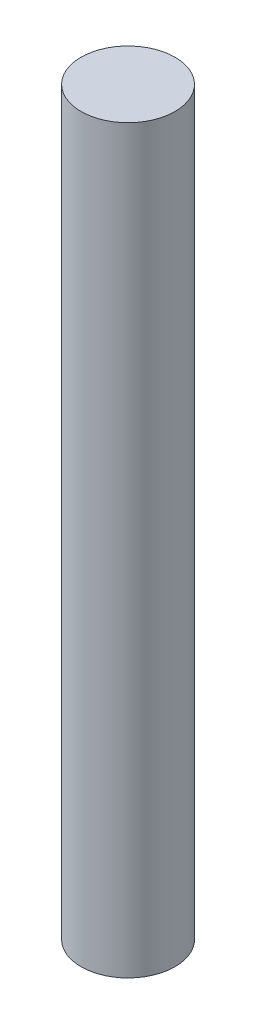
ISO-10303-21;
HEADER;
FILE_DESCRIPTION(('STEP AP214'),'2;1');
FILE_NAME('part.step','',(''),(''),'','','');
FILE_SCHEMA(('AUTOMOTIVE_DESIGN { 1 0 10303 214 1 1 1 1 }'));
ENDSEC;
DATA;
#1=APPLICATION_CONTEXT('core data for automotive mechanical design processes');
#2=APPLICATION_PROTOCOL_DEFINITION('international standard','automotive_design',2000,#1);
#3=PRODUCT_CONTEXT('',#1,'mechanical');
#4=PRODUCT('Part','Part','',(#3));
#5=PRODUCT_RELATED_PRODUCT_CATEGORY('part','',(#4));
#6=PRODUCT_DEFINITION_FORMATION('','',#4);
#7=PRODUCT_DEFINITION_CONTEXT('part definition',#1,'design');
#8=PRODUCT_DEFINITION('design','',#6,#7);
#9=PRODUCT_DEFINITION_SHAPE('','',#8);
#10=(LENGTH_UNIT() NAMED_UNIT(*) SI_UNIT(.MILLI.,.METRE.));
#11=(NAMED_UNIT(*) PLANE_ANGLE_UNIT() SI_UNIT($,.RADIAN.));
#12=(NAMED_UNIT(*) SI_UNIT($,.STERADIAN.) SOLID_ANGLE_UNIT());
#13=UNCERTAINTY_MEASURE_WITH_UNIT(LENGTH_MEASURE(1.E-05),#10,'distance_accuracy_value','');
#14=(GEOMETRIC_REPRESENTATION_CONTEXT(3) GLOBAL_UNCERTAINTY_ASSIGNED_CONTEXT((#13)) GLOBAL_UNIT_ASSIGNED_CONTEXT((#10,
#11,#12)) REPRESENTATION_CONTEXT('',''));
#15=CARTESIAN_POINT('',(0.,0.,0.));
#16=DIRECTION('',(0.,0.,1.));
#17=DIRECTION('',(1.,0.,0.));
#18=AXIS2_PLACEMENT_3D('',#15,#16,#17);
#19=CARTESIAN_POINT('',(0.,0.,0.));
#20=DIRECTION('',(0.,1.,0.));
#21=DIRECTION('',(0.,0.,1.));
#22=AXIS2_PLACEMENT_3D('',#19,#20,#21);
#23=PLANE('',#22);
#24=CARTESIAN_POINT('',(0.,0.,0.));
#25=DIRECTION('',(0.,1.,0.));
#26=DIRECTION('',(0.,0.,1.));
#27=AXIS2_PLACEMENT_3D('',#24,#25,#26);
#28=CIRCLE('',#27,3.175);
#29=CARTESIAN_POINT('',(0.,0.,-3.175));
#30=VERTEX_POINT('',#29);
#31=EDGE_CURVE('E44',#30,#30,#28,.T.);
#32=ORIENTED_EDGE('',*,*,#31,.F.);
#33=EDGE_LOOP('',(#32));
#34=FACE_BOUND('',#33,.T.);
#35=ADVANCED_FACE('F37',(#34),#23,.F.);
#36=CARTESIAN_POINT('',(0.,59.0052561210692,0.));
#37=DIRECTION('',(0.,-1.,0.));
#38=DIRECTION('',(0.,0.,-1.));
#39=AXIS2_PLACEMENT_3D('',#36,#37,#38);
#40=CYLINDRICAL_SURFACE('',#39,3.175);
#41=CARTESIAN_POINT('',(0.,50.025,0.));
#42=DIRECTION('',(0.,-1.,0.));
#43=DIRECTION('',(0.,0.,-1.));
#44=AXIS2_PLACEMENT_3D('',#41,#42,#43);
#45=CIRCLE('',#44,3.175);
#46=CARTESIAN_POINT('',(0.,50.025,-3.175));
#47=VERTEX_POINT('',#46);
#48=EDGE_CURVE('E10',#47,#47,#45,.T.);
#49=CARTESIAN_POINT('',(0.,50.025,-3.175));
#50=CARTESIAN_POINT('',(0.,49.50390625,-3.175));
#51=CARTESIAN_POINT('',(0.,48.9828125,-3.175));
#52=CARTESIAN_POINT('',(0.,47.940625,-3.175));
#53=CARTESIAN_POINT('',(0.,47.41953125,-3.175));
#54=CARTESIAN_POINT('',(0.,46.37734375,-3.175));
#55=CARTESIAN_POINT('',(0.,45.85625,-3.175));
#56=CARTESIAN_POINT('',(0.,44.8140625,-3.175));
#57=CARTESIAN_POINT('',(0.,44.29296875,-3.175));
#58=CARTESIAN_POINT('',(0.,43.25078125,-3.175));
#59=CARTESIAN_POINT('',(0.,42.7296875,-3.175));
#60=CARTESIAN_POINT('',(0.,41.6875,-3.175));
#61=CARTESIAN_POINT('',(0.,41.16640625,-3.175));
#62=CARTESIAN_POINT('',(0.,40.12421875,-3.175));
#63=CARTESIAN_POINT('',(0.,39.603125,-3.175));
#64=CARTESIAN_POINT('',(0.,38.5609375,-3.175));
#65=CARTESIAN_POINT('',(0.,38.03984375,-3.175));
#66=CARTESIAN_POINT('',(0.,36.99765625,-3.175));
#67=CARTESIAN_POINT('',(0.,36.4765625,-3.175));
#68=CARTESIAN_POINT('',(0.,35.434375,-3.175));
#69=CARTESIAN_POINT('',(0.,34.91328125,-3.175));
#70=CARTESIAN_POINT('',(0.,33.87109375,-3.175));
#71=CARTESIAN_POINT('',(0.,33.35,-3.175));
#72=CARTESIAN_POINT('',(0.,32.3078125,-3.175));
#73=CARTESIAN_POINT('',(0.,31.78671875,-3.175));
#74=CARTESIAN_POINT('',(0.,30.74453125,-3.175));
#75=CARTESIAN_POINT('',(0.,30.2234375,-3.175));
#76=CARTESIAN_POINT('',(0.,29.18125,-3.175));
#77=CARTESIAN_POINT('',(0.,28.66015625,-3.175));
#78=CARTESIAN_POINT('',(0.,27.61796875,-3.175));
#79=CARTESIAN_POINT('',(0.,27.096875,-3.175));
#80=CARTESIAN_POINT('',(0.,26.0546875,-3.175));
#81=CARTESIAN_POINT('',(0.,25.53359375,-3.175));
#82=CARTESIAN_POINT('',(0.,24.49140625,-3.175));
#83=CARTESIAN_POINT('',(0.,23.9703125,-3.175));
#84=CARTESIAN_POINT('',(0.,22.928125,-3.175));
#85=CARTESIAN_POINT('',(0.,22.40703125,-3.175));
#86=CARTESIAN_POINT('',(0.,21.36484375,-3.175));
#87=CARTESIAN_POINT('',(0.,20.84375,-3.175));
#88=CARTESIAN_POINT('',(0.,19.8015625,-3.175));
#89=CARTESIAN_POINT('',(0.,19.28046875,-3.175));
#90=CARTESIAN_POINT('',(0.,18.23828125,-3.175));
#91=CARTESIAN_POINT('',(0.,17.7171875,-3.175));
#92=CARTESIAN_POINT('',(0.,16.675,-3.175));
#93=CARTESIAN_POINT('',(0.,16.15390625,-3.175));
#94=CARTESIAN_POINT('',(0.,15.11171875,-3.175));
#95=CARTESIAN_POINT('',(0.,14.590625,-3.175));
#96=CARTESIAN_POINT('',(0.,13.5484375,-3.175));
#97=CARTESIAN_POINT('',(0.,13.02734375,-3.175));
#98=CARTESIAN_POINT('',(0.,11.98515625,-3.175));
#99=CARTESIAN_POINT('',(0.,11.4640625,-3.175));
#100=CARTESIAN_POINT('',(0.,10.421875,-3.175));
#101=CARTESIAN_POINT('',(0.,9.90078125,-3.175));
#102=CARTESIAN_POINT('',(0.,8.85859375,-3.175));
#103=CARTESIAN_POINT('',(0.,8.3375,-3.175));
#104=CARTESIAN_POINT('',(0.,7.2953125,-3.175));
#105=CARTESIAN_POINT('',(0.,6.77421875,-3.175));
#106=CARTESIAN_POINT('',(0.,5.73203125,-3.175));
#107=CARTESIAN_POINT('',(0.,5.2109375,-3.175));
#108=CARTESIAN_POINT('',(0.,4.16875,-3.175));
#109=CARTESIAN_POINT('',(0.,3.64765625,-3.175));
#110=CARTESIAN_POINT('',(0.,2.60546875,-3.175));
#111=CARTESIAN_POINT('',(0.,2.08437499999999,-3.175));
#112=CARTESIAN_POINT('',(0.,1.04218749999999,-3.175));
#113=CARTESIAN_POINT('',(0.,0.521093749999994,-3.175));
#114=CARTESIAN_POINT('',(0.,0.,-3.175));
#115=B_SPLINE_CURVE_WITH_KNOTS('',3,(#49,#50,#51,#52,#53,#54,#55,#56,#57,#58,#59,#60,#61,#62,
#63,#64,#65,#66,#67,#68,#69,#70,#71,#72,#73,#74,#75,#76,#77,#78,#79,#80,#81,#82,#83,#84,#85,#86,
#87,#88,#89,#90,#91,#92,#93,#94,#95,#96,#97,#98,#99,#100,#101,#102,#103,#104,#105,#106,#107,
#108,#109,#110,#111,#112,#113,#114),.UNSPECIFIED.,.F.,.F.,(4,2,2,2,2,2,2,2,2,2,2,2,2,2,2,2,2,2,
2,2,2,2,2,2,2,2,2,2,2,2,2,2,4),(0.,1.56328125,3.1265625,4.68984375000001,6.25312500000001,
7.81640625,9.3796875,10.94296875,12.50625,14.06953125,15.6328125,17.19609375,18.759375,
20.32265625,21.8859375,23.44921875,25.0125,26.57578125,28.1390625,29.70234375,31.265625,
32.82890625,34.3921875,35.95546875,37.51875,39.08203125,40.6453125,42.20859375,43.771875,
45.33515625,46.8984375,48.46171875,50.025),.UNSPECIFIED.);
#116=EDGE_CURVE('BSEAM39',#47,#30,#115,.T.);
#117=ORIENTED_EDGE('',*,*,#48,.T.);
#118=ORIENTED_EDGE('',*,*,#31,.T.);
#119=ORIENTED_EDGE('',*,*,#116,.T.);
#120=ORIENTED_EDGE('',*,*,#116,.F.);
#121=EDGE_LOOP('',(#117,#119,#118,#120));
#122=FACE_BOUND('',#121,.T.);
#123=ADVANCED_FACE('F39',(#122),#40,.T.);
#124=CARTESIAN_POINT('',(5.48172618408671E-13,50.025,3.7470027081099E-13));
#125=DIRECTION('',(0.,-1.,0.));
#126=DIRECTION('',(0.967256719092633,0.,-0.253799998759172));
#127=AXIS2_PLACEMENT_3D('',#124,#125,#126);
#128=PLANE('',#127);
#129=ORIENTED_EDGE('',*,*,#48,.F.);
#130=EDGE_LOOP('',(#129));
#131=FACE_BOUND('',#130,.T.);
#132=ADVANCED_FACE('F55',(#131),#128,.F.);
#133=CLOSED_SHELL('',(#35,#123,#132));
#134=MANIFOLD_SOLID_BREP('B2',#133);
#135=ADVANCED_BREP_SHAPE_REPRESENTATION('',(#18,#134),#14);
#136=SHAPE_DEFINITION_REPRESENTATION(#9,#135);
ENDSEC;
END-ISO-10303-21;
